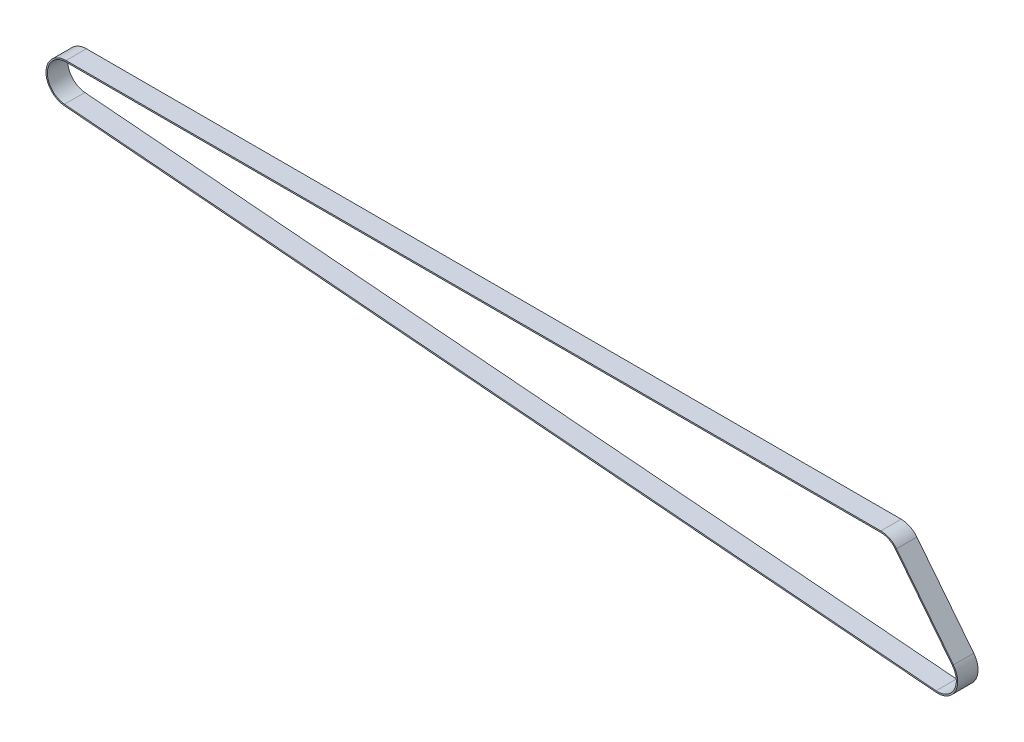
ISO-10303-21;
HEADER;
FILE_DESCRIPTION(('STEP AP214'),'2;1');
FILE_NAME('part.step','',(''),(''),'','','');
FILE_SCHEMA(('AUTOMOTIVE_DESIGN { 1 0 10303 214 1 1 1 1 }'));
ENDSEC;
DATA;
#1=APPLICATION_CONTEXT('core data for automotive mechanical design processes');
#2=APPLICATION_PROTOCOL_DEFINITION('international standard','automotive_design',2000,#1);
#3=PRODUCT_CONTEXT('',#1,'mechanical');
#4=PRODUCT('Part','Part','',(#3));
#5=PRODUCT_RELATED_PRODUCT_CATEGORY('part','',(#4));
#6=PRODUCT_DEFINITION_FORMATION('','',#4);
#7=PRODUCT_DEFINITION_CONTEXT('part definition',#1,'design');
#8=PRODUCT_DEFINITION('design','',#6,#7);
#9=PRODUCT_DEFINITION_SHAPE('','',#8);
#10=(LENGTH_UNIT() NAMED_UNIT(*) SI_UNIT(.MILLI.,.METRE.));
#11=(NAMED_UNIT(*) PLANE_ANGLE_UNIT() SI_UNIT($,.RADIAN.));
#12=(NAMED_UNIT(*) SI_UNIT($,.STERADIAN.) SOLID_ANGLE_UNIT());
#13=UNCERTAINTY_MEASURE_WITH_UNIT(LENGTH_MEASURE(1.E-05),#10,'distance_accuracy_value','');
#14=(GEOMETRIC_REPRESENTATION_CONTEXT(3) GLOBAL_UNCERTAINTY_ASSIGNED_CONTEXT((#13)) GLOBAL_UNIT_ASSIGNED_CONTEXT((#10,
#11,#12)) REPRESENTATION_CONTEXT('',''));
#15=CARTESIAN_POINT('',(0.,0.,0.));
#16=DIRECTION('',(0.,0.,1.));
#17=DIRECTION('',(1.,0.,0.));
#18=AXIS2_PLACEMENT_3D('',#15,#16,#17);
#19=CARTESIAN_POINT('',(-240.,0.,6.));
#20=DIRECTION('',(0.,0.,-1.));
#21=DIRECTION('',(-1.,0.,0.));
#22=AXIS2_PLACEMENT_3D('',#19,#20,#21);
#23=PLANE('',#22);
#24=CARTESIAN_POINT('',(-240.,0.,6.));
#25=DIRECTION('',(0.,0.,-1.));
#26=DIRECTION('',(-1.,0.,0.));
#27=AXIS2_PLACEMENT_3D('',#24,#25,#26);
#28=CIRCLE('',#27,11.8);
#29=CARTESIAN_POINT('',(-240.,11.8,6.));
#30=VERTEX_POINT('',#29);
#31=CARTESIAN_POINT('',(-240.973303041411,-11.7597908650444,6.));
#32=VERTEX_POINT('',#31);
#33=EDGE_CURVE('E208',#30,#32,#28,.F.);
#34=ORIENTED_EDGE('',*,*,#33,.T.);
#35=DIRECTION('',(0.9965924461902,-0.0824833085941255,0.));
#36=VECTOR('',#35,1.);
#37=CARTESIAN_POINT('',(-240.973303041411,-11.7597908650444,6.));
#38=LINE('',#37,#36);
#39=CARTESIAN_POINT('',(272.52669695859,-54.2597908650444,6.));
#40=VERTEX_POINT('',#39);
#41=EDGE_CURVE('E211',#32,#40,#38,.T.);
#42=ORIENTED_EDGE('',*,*,#41,.T.);
#43=CARTESIAN_POINT('',(273.5,-42.4999999999994,6.));
#44=DIRECTION('',(0.,0.,-1.));
#45=DIRECTION('',(-1.,0.,0.));
#46=AXIS2_PLACEMENT_3D('',#43,#44,#45);
#47=CIRCLE('',#46,11.8000000000005);
#48=CARTESIAN_POINT('',(282.767195461928,-35.1952694594226,6.));
#49=VERTEX_POINT('',#48);
#50=EDGE_CURVE('E214',#40,#49,#47,.F.);
#51=ORIENTED_EDGE('',*,*,#50,.T.);
#52=DIRECTION('',(-0.619044961065889,0.785355547620905,0.));
#53=VECTOR('',#52,1.);
#54=CARTESIAN_POINT('',(65.3231968278146,240.666519852512,6.));
#55=LINE('',#54,#53);
#56=CARTESIAN_POINT('',(249.267195461928,7.3047305405775,6.));
#57=VERTEX_POINT('',#56);
#58=EDGE_CURVE('E216',#49,#57,#55,.T.);
#59=ORIENTED_EDGE('',*,*,#58,.T.);
#60=CARTESIAN_POINT('',(240.000000000001,0.,6.));
#61=DIRECTION('',(0.,0.,-1.));
#62=DIRECTION('',(-1.,0.,0.));
#63=AXIS2_PLACEMENT_3D('',#60,#61,#62);
#64=CIRCLE('',#63,11.8);
#65=CARTESIAN_POINT('',(240.000000000001,11.8,6.));
#66=VERTEX_POINT('',#65);
#67=EDGE_CURVE('E218',#57,#66,#64,.F.);
#68=ORIENTED_EDGE('',*,*,#67,.T.);
#69=DIRECTION('',(-1.,0.,0.));
#70=VECTOR('',#69,1.);
#71=CARTESIAN_POINT('',(-240.,11.8,6.));
#72=LINE('',#71,#70);
#73=EDGE_CURVE('E220',#66,#30,#72,.T.);
#74=ORIENTED_EDGE('',*,*,#73,.T.);
#75=EDGE_LOOP('',(#34,#42,#51,#59,#68,#74));
#76=FACE_BOUND('',#75,.T.);
#77=CARTESIAN_POINT('',(-240.,0.,6.));
#78=DIRECTION('',(0.,0.,1.));
#79=DIRECTION('',(-1.,0.,0.));
#80=AXIS2_PLACEMENT_3D('',#77,#78,#79);
#81=CIRCLE('',#80,11.);
#82=CARTESIAN_POINT('',(-240.,11.,6.));
#83=VERTEX_POINT('',#82);
#84=CARTESIAN_POINT('',(-240.907316394535,-10.9625169080922,6.));
#85=VERTEX_POINT('',#84);
#86=EDGE_CURVE('E157',#83,#85,#81,.T.);
#87=ORIENTED_EDGE('',*,*,#86,.F.);
#88=DIRECTION('',(-1.,0.,0.));
#89=VECTOR('',#88,1.);
#90=CARTESIAN_POINT('',(-240.,11.,6.));
#91=LINE('',#90,#89);
#92=CARTESIAN_POINT('',(240.000000000001,11.,6.));
#93=VERTEX_POINT('',#92);
#94=EDGE_CURVE('E186',#93,#83,#91,.T.);
#95=ORIENTED_EDGE('',*,*,#94,.F.);
#96=CARTESIAN_POINT('',(240.000000000001,0.,6.));
#97=DIRECTION('',(0.,0.,1.));
#98=DIRECTION('',(-1.,0.,0.));
#99=AXIS2_PLACEMENT_3D('',#96,#97,#98);
#100=CIRCLE('',#99,11.);
#101=CARTESIAN_POINT('',(248.638911023831,6.80949457172479,6.));
#102=VERTEX_POINT('',#101);
#103=EDGE_CURVE('E184',#102,#93,#100,.T.);
#104=ORIENTED_EDGE('',*,*,#103,.F.);
#105=DIRECTION('',(-0.619044961065889,0.785355547620905,0.));
#106=VECTOR('',#105,1.);
#107=CARTESIAN_POINT('',(248.638911023831,6.80949457172479,6.));
#108=LINE('',#107,#106);
#109=CARTESIAN_POINT('',(282.138911023831,-35.6905054282753,6.));
#110=VERTEX_POINT('',#109);
#111=EDGE_CURVE('E180',#110,#102,#108,.T.);
#112=ORIENTED_EDGE('',*,*,#111,.F.);
#113=CARTESIAN_POINT('',(273.5,-42.4999999999994,6.));
#114=DIRECTION('',(0.,0.,1.));
#115=DIRECTION('',(-1.,0.,0.));
#116=AXIS2_PLACEMENT_3D('',#113,#114,#115);
#117=CIRCLE('',#116,11.0000000000005);
#118=CARTESIAN_POINT('',(272.592683605465,-53.4625169080922,6.));
#119=VERTEX_POINT('',#118);
#120=EDGE_CURVE('E178',#119,#110,#117,.T.);
#121=ORIENTED_EDGE('',*,*,#120,.F.);
#122=DIRECTION('',(0.9965924461902,-0.0824833085941255,0.));
#123=VECTOR('',#122,1.);
#124=CARTESIAN_POINT('',(-240.907316394535,-10.9625169080922,6.));
#125=LINE('',#124,#123);
#126=EDGE_CURVE('E165',#85,#119,#125,.T.);
#127=ORIENTED_EDGE('',*,*,#126,.F.);
#128=EDGE_LOOP('',(#87,#95,#104,#112,#121,#127));
#129=FACE_BOUND('',#128,.T.);
#130=ADVANCED_FACE('F68',(#76,#129),#23,.F.);
#131=CARTESIAN_POINT('',(-240.,0.,-6.));
#132=DIRECTION('',(0.,0.,-1.));
#133=DIRECTION('',(-1.,0.,0.));
#134=AXIS2_PLACEMENT_3D('',#131,#132,#133);
#135=PLANE('',#134);
#136=CARTESIAN_POINT('',(-240.,0.,-6.));
#137=DIRECTION('',(0.,0.,-1.));
#138=DIRECTION('',(-1.,0.,0.));
#139=AXIS2_PLACEMENT_3D('',#136,#137,#138);
#140=CIRCLE('',#139,11.8);
#141=CARTESIAN_POINT('',(-240.,11.8,-6.));
#142=VERTEX_POINT('',#141);
#143=CARTESIAN_POINT('',(-240.973303041411,-11.7597908650444,-6.));
#144=VERTEX_POINT('',#143);
#145=EDGE_CURVE('E173',#142,#144,#140,.F.);
#146=ORIENTED_EDGE('',*,*,#145,.F.);
#147=DIRECTION('',(-1.,0.,0.));
#148=VECTOR('',#147,1.);
#149=CARTESIAN_POINT('',(-240.,11.8,-6.));
#150=LINE('',#149,#148);
#151=CARTESIAN_POINT('',(240.000000000001,11.8,-6.));
#152=VERTEX_POINT('',#151);
#153=EDGE_CURVE('E212',#152,#142,#150,.T.);
#154=ORIENTED_EDGE('',*,*,#153,.F.);
#155=CARTESIAN_POINT('',(240.000000000001,0.,-6.));
#156=DIRECTION('',(0.,0.,-1.));
#157=DIRECTION('',(-1.,0.,0.));
#158=AXIS2_PLACEMENT_3D('',#155,#156,#157);
#159=CIRCLE('',#158,11.8);
#160=CARTESIAN_POINT('',(249.267195461928,7.3047305405775,-6.));
#161=VERTEX_POINT('',#160);
#162=EDGE_CURVE('E231',#161,#152,#159,.F.);
#163=ORIENTED_EDGE('',*,*,#162,.F.);
#164=DIRECTION('',(-0.619044961065889,0.785355547620905,0.));
#165=VECTOR('',#164,1.);
#166=CARTESIAN_POINT('',(65.3231968278146,240.666519852512,-6.));
#167=LINE('',#166,#165);
#168=CARTESIAN_POINT('',(282.767195461928,-35.1952694594226,-6.));
#169=VERTEX_POINT('',#168);
#170=EDGE_CURVE('E229',#169,#161,#167,.T.);
#171=ORIENTED_EDGE('',*,*,#170,.F.);
#172=CARTESIAN_POINT('',(273.5,-42.4999999999994,-6.));
#173=DIRECTION('',(0.,0.,-1.));
#174=DIRECTION('',(-1.,0.,0.));
#175=AXIS2_PLACEMENT_3D('',#172,#173,#174);
#176=CIRCLE('',#175,11.8000000000005);
#177=CARTESIAN_POINT('',(272.52669695859,-54.2597908650444,-6.));
#178=VERTEX_POINT('',#177);
#179=EDGE_CURVE('E227',#178,#169,#176,.F.);
#180=ORIENTED_EDGE('',*,*,#179,.F.);
#181=DIRECTION('',(0.9965924461902,-0.0824833085941255,0.));
#182=VECTOR('',#181,1.);
#183=CARTESIAN_POINT('',(-240.973303041411,-11.7597908650444,-6.));
#184=LINE('',#183,#182);
#185=EDGE_CURVE('E225',#144,#178,#184,.T.);
#186=ORIENTED_EDGE('',*,*,#185,.F.);
#187=EDGE_LOOP('',(#146,#154,#163,#171,#180,#186));
#188=FACE_BOUND('',#187,.T.);
#189=DIRECTION('',(-1.,0.,0.));
#190=VECTOR('',#189,1.);
#191=CARTESIAN_POINT('',(-240.,11.,-6.));
#192=LINE('',#191,#190);
#193=CARTESIAN_POINT('',(240.000000000001,11.,-6.));
#194=VERTEX_POINT('',#193);
#195=CARTESIAN_POINT('',(-240.,11.,-6.));
#196=VERTEX_POINT('',#195);
#197=EDGE_CURVE('E166',#194,#196,#192,.T.);
#198=ORIENTED_EDGE('',*,*,#197,.T.);
#199=CARTESIAN_POINT('',(-240.,0.,-6.));
#200=DIRECTION('',(0.,0.,1.));
#201=DIRECTION('',(-1.,0.,0.));
#202=AXIS2_PLACEMENT_3D('',#199,#200,#201);
#203=CIRCLE('',#202,11.);
#204=CARTESIAN_POINT('',(-240.907316394535,-10.9625169080922,-6.));
#205=VERTEX_POINT('',#204);
#206=EDGE_CURVE('E91',#196,#205,#203,.T.);
#207=ORIENTED_EDGE('',*,*,#206,.T.);
#208=DIRECTION('',(0.9965924461902,-0.0824833085941255,0.));
#209=VECTOR('',#208,1.);
#210=CARTESIAN_POINT('',(-240.907316394535,-10.9625169080922,-6.));
#211=LINE('',#210,#209);
#212=CARTESIAN_POINT('',(272.592683605465,-53.4625169080922,-6.));
#213=VERTEX_POINT('',#212);
#214=EDGE_CURVE('E172',#205,#213,#211,.T.);
#215=ORIENTED_EDGE('',*,*,#214,.T.);
#216=CARTESIAN_POINT('',(273.5,-42.4999999999994,-6.));
#217=DIRECTION('',(0.,0.,1.));
#218=DIRECTION('',(-1.,0.,0.));
#219=AXIS2_PLACEMENT_3D('',#216,#217,#218);
#220=CIRCLE('',#219,11.0000000000005);
#221=CARTESIAN_POINT('',(282.138911023831,-35.6905054282753,-6.));
#222=VERTEX_POINT('',#221);
#223=EDGE_CURVE('E190',#213,#222,#220,.T.);
#224=ORIENTED_EDGE('',*,*,#223,.T.);
#225=DIRECTION('',(-0.619044961065889,0.785355547620905,0.));
#226=VECTOR('',#225,1.);
#227=CARTESIAN_POINT('',(248.638911023831,6.80949457172479,-6.));
#228=LINE('',#227,#226);
#229=CARTESIAN_POINT('',(248.638911023831,6.80949457172479,-6.));
#230=VERTEX_POINT('',#229);
#231=EDGE_CURVE('E193',#222,#230,#228,.T.);
#232=ORIENTED_EDGE('',*,*,#231,.T.);
#233=CARTESIAN_POINT('',(240.000000000001,0.,-6.));
#234=DIRECTION('',(0.,0.,1.));
#235=DIRECTION('',(-1.,0.,0.));
#236=AXIS2_PLACEMENT_3D('',#233,#234,#235);
#237=CIRCLE('',#236,11.);
#238=EDGE_CURVE('E196',#230,#194,#237,.T.);
#239=ORIENTED_EDGE('',*,*,#238,.T.);
#240=EDGE_LOOP('',(#198,#207,#215,#224,#232,#239));
#241=FACE_BOUND('',#240,.T.);
#242=ADVANCED_FACE('F255',(#188,#241),#135,.T.);
#243=CARTESIAN_POINT('',(-240.,0.,6.));
#244=DIRECTION('',(0.,0.,-1.));
#245=DIRECTION('',(-1.,0.,0.));
#246=AXIS2_PLACEMENT_3D('',#243,#244,#245);
#247=CYLINDRICAL_SURFACE('',#246,11.8);
#248=ORIENTED_EDGE('',*,*,#145,.T.);
#249=DIRECTION('',(0.,0.,-1.));
#250=VECTOR('',#249,1.);
#251=CARTESIAN_POINT('',(-240.973303041411,-11.7597908650444,6.));
#252=LINE('',#251,#250);
#253=EDGE_CURVE('E12',#32,#144,#252,.T.);
#254=ORIENTED_EDGE('',*,*,#253,.F.);
#255=ORIENTED_EDGE('',*,*,#33,.F.);
#256=DIRECTION('',(0.,0.,-1.));
#257=VECTOR('',#256,1.);
#258=CARTESIAN_POINT('',(-240.,11.8,6.));
#259=LINE('',#258,#257);
#260=EDGE_CURVE('E222',#30,#142,#259,.T.);
#261=ORIENTED_EDGE('',*,*,#260,.T.);
#262=EDGE_LOOP('',(#248,#254,#255,#261));
#263=FACE_BOUND('',#262,.T.);
#264=ADVANCED_FACE('F70',(#263),#247,.T.);
#265=CARTESIAN_POINT('',(-240.973303041411,-11.7597908650444,6.));
#266=DIRECTION('',(0.0824833085941255,0.9965924461902,0.));
#267=DIRECTION('',(-0.9965924461902,0.0824833085941255,0.));
#268=AXIS2_PLACEMENT_3D('',#265,#266,#267);
#269=PLANE('',#268);
#270=ORIENTED_EDGE('',*,*,#185,.T.);
#271=DIRECTION('',(0.,0.,-1.));
#272=VECTOR('',#271,1.);
#273=CARTESIAN_POINT('',(272.52669695859,-54.2597908650444,6.));
#274=LINE('',#273,#272);
#275=EDGE_CURVE('E76',#40,#178,#274,.T.);
#276=ORIENTED_EDGE('',*,*,#275,.F.);
#277=ORIENTED_EDGE('',*,*,#41,.F.);
#278=ORIENTED_EDGE('',*,*,#253,.T.);
#279=EDGE_LOOP('',(#270,#276,#277,#278));
#280=FACE_BOUND('',#279,.T.);
#281=ADVANCED_FACE('F272',(#280),#269,.F.);
#282=CARTESIAN_POINT('',(273.5,-42.4999999999994,6.));
#283=DIRECTION('',(0.,0.,-1.));
#284=DIRECTION('',(-1.,0.,0.));
#285=AXIS2_PLACEMENT_3D('',#282,#283,#284);
#286=CYLINDRICAL_SURFACE('',#285,11.8000000000005);
#287=ORIENTED_EDGE('',*,*,#179,.T.);
#288=DIRECTION('',(0.,0.,-1.));
#289=VECTOR('',#288,1.);
#290=CARTESIAN_POINT('',(282.767195461928,-35.1952694594226,6.));
#291=LINE('',#290,#289);
#292=EDGE_CURVE('E242',#49,#169,#291,.T.);
#293=ORIENTED_EDGE('',*,*,#292,.F.);
#294=ORIENTED_EDGE('',*,*,#50,.F.);
#295=ORIENTED_EDGE('',*,*,#275,.T.);
#296=EDGE_LOOP('',(#287,#293,#294,#295));
#297=FACE_BOUND('',#296,.T.);
#298=ADVANCED_FACE('F249',(#297),#286,.T.);
#299=CARTESIAN_POINT('',(65.3231968278146,240.666519852512,6.));
#300=DIRECTION('',(-0.785355547620905,-0.619044961065889,0.));
#301=DIRECTION('',(0.619044961065889,-0.785355547620905,0.));
#302=AXIS2_PLACEMENT_3D('',#299,#300,#301);
#303=PLANE('',#302);
#304=ORIENTED_EDGE('',*,*,#170,.T.);
#305=DIRECTION('',(0.,0.,-1.));
#306=VECTOR('',#305,1.);
#307=CARTESIAN_POINT('',(249.267195461928,7.3047305405775,6.));
#308=LINE('',#307,#306);
#309=EDGE_CURVE('E239',#57,#161,#308,.T.);
#310=ORIENTED_EDGE('',*,*,#309,.F.);
#311=ORIENTED_EDGE('',*,*,#58,.F.);
#312=ORIENTED_EDGE('',*,*,#292,.T.);
#313=EDGE_LOOP('',(#304,#310,#311,#312));
#314=FACE_BOUND('',#313,.T.);
#315=ADVANCED_FACE('F261',(#314),#303,.F.);
#316=CARTESIAN_POINT('',(240.000000000001,0.,6.));
#317=DIRECTION('',(0.,0.,-1.));
#318=DIRECTION('',(-1.,0.,0.));
#319=AXIS2_PLACEMENT_3D('',#316,#317,#318);
#320=CYLINDRICAL_SURFACE('',#319,11.8);
#321=ORIENTED_EDGE('',*,*,#162,.T.);
#322=DIRECTION('',(0.,0.,-1.));
#323=VECTOR('',#322,1.);
#324=CARTESIAN_POINT('',(240.000000000001,11.8,6.));
#325=LINE('',#324,#323);
#326=EDGE_CURVE('E236',#66,#152,#325,.T.);
#327=ORIENTED_EDGE('',*,*,#326,.F.);
#328=ORIENTED_EDGE('',*,*,#67,.F.);
#329=ORIENTED_EDGE('',*,*,#309,.T.);
#330=EDGE_LOOP('',(#321,#327,#328,#329));
#331=FACE_BOUND('',#330,.T.);
#332=ADVANCED_FACE('F265',(#331),#320,.T.);
#333=CARTESIAN_POINT('',(-240.,11.8,6.));
#334=DIRECTION('',(0.,-1.,0.));
#335=DIRECTION('',(0.,0.,-1.));
#336=AXIS2_PLACEMENT_3D('',#333,#334,#335);
#337=PLANE('',#336);
#338=ORIENTED_EDGE('',*,*,#153,.T.);
#339=ORIENTED_EDGE('',*,*,#260,.F.);
#340=ORIENTED_EDGE('',*,*,#73,.F.);
#341=ORIENTED_EDGE('',*,*,#326,.T.);
#342=EDGE_LOOP('',(#338,#339,#340,#341));
#343=FACE_BOUND('',#342,.T.);
#344=ADVANCED_FACE('F275',(#343),#337,.F.);
#345=CARTESIAN_POINT('',(-240.,0.,6.));
#346=DIRECTION('',(0.,0.,-1.));
#347=DIRECTION('',(-1.,0.,0.));
#348=AXIS2_PLACEMENT_3D('',#345,#346,#347);
#349=CYLINDRICAL_SURFACE('',#348,11.);
#350=ORIENTED_EDGE('',*,*,#206,.F.);
#351=DIRECTION('',(0.,0.,-1.));
#352=VECTOR('',#351,1.);
#353=CARTESIAN_POINT('',(-240.,11.,6.));
#354=LINE('',#353,#352);
#355=EDGE_CURVE('E161',#83,#196,#354,.T.);
#356=ORIENTED_EDGE('',*,*,#355,.F.);
#357=ORIENTED_EDGE('',*,*,#86,.T.);
#358=DIRECTION('',(0.,0.,-1.));
#359=VECTOR('',#358,1.);
#360=CARTESIAN_POINT('',(-240.907316394535,-10.9625169080922,6.));
#361=LINE('',#360,#359);
#362=EDGE_CURVE('E160',#85,#205,#361,.T.);
#363=ORIENTED_EDGE('',*,*,#362,.T.);
#364=EDGE_LOOP('',(#350,#356,#357,#363));
#365=FACE_BOUND('',#364,.T.);
#366=ADVANCED_FACE('F159',(#365),#349,.F.);
#367=CARTESIAN_POINT('',(-240.907316394535,-10.9625169080922,6.));
#368=DIRECTION('',(0.0824833085941255,0.9965924461902,0.));
#369=DIRECTION('',(-0.9965924461902,0.0824833085941255,0.));
#370=AXIS2_PLACEMENT_3D('',#367,#368,#369);
#371=PLANE('',#370);
#372=ORIENTED_EDGE('',*,*,#214,.F.);
#373=ORIENTED_EDGE('',*,*,#362,.F.);
#374=ORIENTED_EDGE('',*,*,#126,.T.);
#375=DIRECTION('',(0.,0.,-1.));
#376=VECTOR('',#375,1.);
#377=CARTESIAN_POINT('',(272.592683605465,-53.4625169080922,6.));
#378=LINE('',#377,#376);
#379=EDGE_CURVE('E174',#119,#213,#378,.T.);
#380=ORIENTED_EDGE('',*,*,#379,.T.);
#381=EDGE_LOOP('',(#372,#373,#374,#380));
#382=FACE_BOUND('',#381,.T.);
#383=ADVANCED_FACE('F169',(#382),#371,.T.);
#384=CARTESIAN_POINT('',(273.5,-42.4999999999994,6.));
#385=DIRECTION('',(0.,0.,-1.));
#386=DIRECTION('',(-1.,0.,0.));
#387=AXIS2_PLACEMENT_3D('',#384,#385,#386);
#388=CYLINDRICAL_SURFACE('',#387,11.0000000000005);
#389=ORIENTED_EDGE('',*,*,#223,.F.);
#390=ORIENTED_EDGE('',*,*,#379,.F.);
#391=ORIENTED_EDGE('',*,*,#120,.T.);
#392=DIRECTION('',(0.,0.,-1.));
#393=VECTOR('',#392,1.);
#394=CARTESIAN_POINT('',(282.138911023831,-35.6905054282753,6.));
#395=LINE('',#394,#393);
#396=EDGE_CURVE('E205',#110,#222,#395,.T.);
#397=ORIENTED_EDGE('',*,*,#396,.T.);
#398=EDGE_LOOP('',(#389,#390,#391,#397));
#399=FACE_BOUND('',#398,.T.);
#400=ADVANCED_FACE('F293',(#399),#388,.F.);
#401=CARTESIAN_POINT('',(248.638911023831,6.80949457172479,6.));
#402=DIRECTION('',(-0.785355547620905,-0.619044961065889,0.));
#403=DIRECTION('',(0.619044961065889,-0.785355547620905,0.));
#404=AXIS2_PLACEMENT_3D('',#401,#402,#403);
#405=PLANE('',#404);
#406=ORIENTED_EDGE('',*,*,#231,.F.);
#407=ORIENTED_EDGE('',*,*,#396,.F.);
#408=ORIENTED_EDGE('',*,*,#111,.T.);
#409=DIRECTION('',(0.,0.,-1.));
#410=VECTOR('',#409,1.);
#411=CARTESIAN_POINT('',(248.638911023831,6.80949457172479,6.));
#412=LINE('',#411,#410);
#413=EDGE_CURVE('E203',#102,#230,#412,.T.);
#414=ORIENTED_EDGE('',*,*,#413,.T.);
#415=EDGE_LOOP('',(#406,#407,#408,#414));
#416=FACE_BOUND('',#415,.T.);
#417=ADVANCED_FACE('F296',(#416),#405,.T.);
#418=CARTESIAN_POINT('',(240.000000000001,0.,6.));
#419=DIRECTION('',(0.,0.,-1.));
#420=DIRECTION('',(-1.,0.,0.));
#421=AXIS2_PLACEMENT_3D('',#418,#419,#420);
#422=CYLINDRICAL_SURFACE('',#421,11.);
#423=ORIENTED_EDGE('',*,*,#238,.F.);
#424=ORIENTED_EDGE('',*,*,#413,.F.);
#425=ORIENTED_EDGE('',*,*,#103,.T.);
#426=DIRECTION('',(0.,0.,-1.));
#427=VECTOR('',#426,1.);
#428=CARTESIAN_POINT('',(240.000000000001,11.,6.));
#429=LINE('',#428,#427);
#430=EDGE_CURVE('E83',#93,#194,#429,.T.);
#431=ORIENTED_EDGE('',*,*,#430,.T.);
#432=EDGE_LOOP('',(#423,#424,#425,#431));
#433=FACE_BOUND('',#432,.T.);
#434=ADVANCED_FACE('F300',(#433),#422,.F.);
#435=CARTESIAN_POINT('',(-240.,11.,6.));
#436=DIRECTION('',(0.,-1.,0.));
#437=DIRECTION('',(0.,0.,-1.));
#438=AXIS2_PLACEMENT_3D('',#435,#436,#437);
#439=PLANE('',#438);
#440=ORIENTED_EDGE('',*,*,#197,.F.);
#441=ORIENTED_EDGE('',*,*,#430,.F.);
#442=ORIENTED_EDGE('',*,*,#94,.T.);
#443=ORIENTED_EDGE('',*,*,#355,.T.);
#444=EDGE_LOOP('',(#440,#441,#442,#443));
#445=FACE_BOUND('',#444,.T.);
#446=ADVANCED_FACE('F304',(#445),#439,.T.);
#447=CLOSED_SHELL('',(#130,#242,#264,#281,#298,#315,#332,#344,#366,#383,#400,#417,#434,#446));
#448=MANIFOLD_SOLID_BREP('B2',#447);
#449=ADVANCED_BREP_SHAPE_REPRESENTATION('',(#18,#448),#14);
#450=SHAPE_DEFINITION_REPRESENTATION(#9,#449);
ENDSEC;
END-ISO-10303-21;
